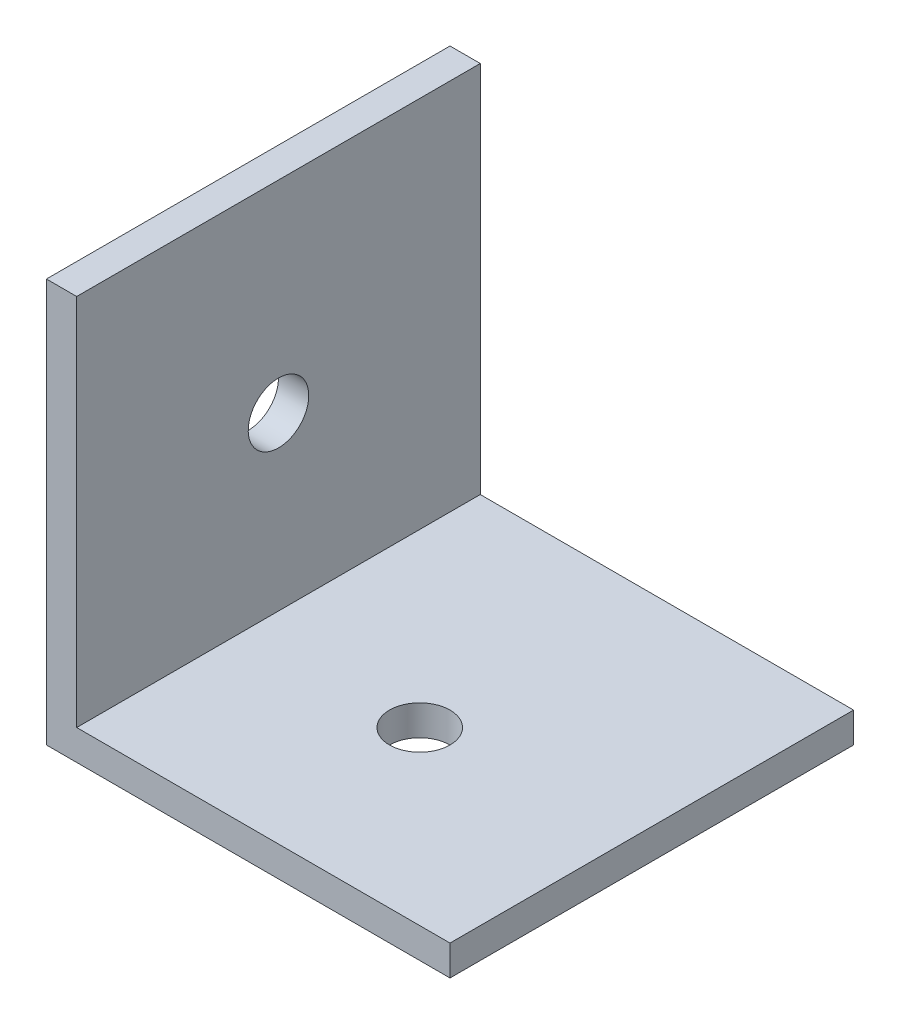
ISO-10303-21;
HEADER;
FILE_DESCRIPTION(('STEP AP214'),'2;1');
FILE_NAME('part.step','',(''),(''),'','','');
FILE_SCHEMA(('AUTOMOTIVE_DESIGN { 1 0 10303 214 1 1 1 1 }'));
ENDSEC;
DATA;
#1=APPLICATION_CONTEXT('core data for automotive mechanical design processes');
#2=APPLICATION_PROTOCOL_DEFINITION('international standard','automotive_design',2000,#1);
#3=PRODUCT_CONTEXT('',#1,'mechanical');
#4=PRODUCT('Part','Part','',(#3));
#5=PRODUCT_RELATED_PRODUCT_CATEGORY('part','',(#4));
#6=PRODUCT_DEFINITION_FORMATION('','',#4);
#7=PRODUCT_DEFINITION_CONTEXT('part definition',#1,'design');
#8=PRODUCT_DEFINITION('design','',#6,#7);
#9=PRODUCT_DEFINITION_SHAPE('','',#8);
#10=(LENGTH_UNIT() NAMED_UNIT(*) SI_UNIT(.MILLI.,.METRE.));
#11=(NAMED_UNIT(*) PLANE_ANGLE_UNIT() SI_UNIT($,.RADIAN.));
#12=(NAMED_UNIT(*) SI_UNIT($,.STERADIAN.) SOLID_ANGLE_UNIT());
#13=UNCERTAINTY_MEASURE_WITH_UNIT(LENGTH_MEASURE(1.E-05),#10,'distance_accuracy_value','');
#14=(GEOMETRIC_REPRESENTATION_CONTEXT(3) GLOBAL_UNCERTAINTY_ASSIGNED_CONTEXT((#13)) GLOBAL_UNIT_ASSIGNED_CONTEXT((#10,
#11,#12)) REPRESENTATION_CONTEXT('',''));
#15=CARTESIAN_POINT('',(0.,0.,0.));
#16=DIRECTION('',(0.,0.,1.));
#17=DIRECTION('',(1.,0.,0.));
#18=AXIS2_PLACEMENT_3D('',#15,#16,#17);
#19=CARTESIAN_POINT('',(0.,20.,20.));
#20=DIRECTION('',(1.,0.,0.));
#21=DIRECTION('',(0.,1.,0.));
#22=AXIS2_PLACEMENT_3D('',#19,#20,#21);
#23=PLANE('',#22);
#24=CARTESIAN_POINT('',(0.,10.,10.));
#25=DIRECTION('',(1.,0.,0.));
#26=DIRECTION('',(0.,1.,0.));
#27=AXIS2_PLACEMENT_3D('',#24,#25,#26);
#28=CIRCLE('',#27,1.5);
#29=CARTESIAN_POINT('',(0.,11.5,10.));
#30=VERTEX_POINT('',#29);
#31=EDGE_CURVE('E159',#30,#30,#28,.T.);
#32=ORIENTED_EDGE('',*,*,#31,.T.);
#33=EDGE_LOOP('',(#32));
#34=FACE_BOUND('',#33,.T.);
#35=DIRECTION('',(0.,-1.,0.));
#36=VECTOR('',#35,1.);
#37=CARTESIAN_POINT('',(0.,20.,0.));
#38=LINE('',#37,#36);
#39=CARTESIAN_POINT('',(0.,20.,0.));
#40=VERTEX_POINT('',#39);
#41=CARTESIAN_POINT('',(0.,0.,0.));
#42=VERTEX_POINT('',#41);
#43=EDGE_CURVE('E115',#40,#42,#38,.T.);
#44=ORIENTED_EDGE('',*,*,#43,.T.);
#45=DIRECTION('',(0.,0.,-1.));
#46=VECTOR('',#45,1.);
#47=CARTESIAN_POINT('',(0.,0.,20.));
#48=LINE('',#47,#46);
#49=CARTESIAN_POINT('',(0.,0.,20.));
#50=VERTEX_POINT('',#49);
#51=EDGE_CURVE('E11',#50,#42,#48,.T.);
#52=ORIENTED_EDGE('',*,*,#51,.F.);
#53=DIRECTION('',(0.,-1.,0.));
#54=VECTOR('',#53,1.);
#55=CARTESIAN_POINT('',(0.,20.,20.));
#56=LINE('',#55,#54);
#57=CARTESIAN_POINT('',(0.,20.,20.));
#58=VERTEX_POINT('',#57);
#59=EDGE_CURVE('E126',#58,#50,#56,.T.);
#60=ORIENTED_EDGE('',*,*,#59,.F.);
#61=DIRECTION('',(0.,0.,-1.));
#62=VECTOR('',#61,1.);
#63=CARTESIAN_POINT('',(0.,20.,20.));
#64=LINE('',#63,#62);
#65=EDGE_CURVE('E111',#58,#40,#64,.T.);
#66=ORIENTED_EDGE('',*,*,#65,.T.);
#67=EDGE_LOOP('',(#44,#52,#60,#66));
#68=FACE_BOUND('',#67,.T.);
#69=ADVANCED_FACE('F31',(#34,#68),#23,.F.);
#70=CARTESIAN_POINT('',(0.,0.,20.));
#71=DIRECTION('',(0.,1.,0.));
#72=DIRECTION('',(0.,0.,1.));
#73=AXIS2_PLACEMENT_3D('',#70,#71,#72);
#74=PLANE('',#73);
#75=CARTESIAN_POINT('',(10.,0.,11.5));
#76=DIRECTION('',(0.,1.,0.));
#77=DIRECTION('',(-1.,0.,0.));
#78=AXIS2_PLACEMENT_3D('',#75,#76,#77);
#79=CIRCLE('',#78,1.5);
#80=CARTESIAN_POINT('',(8.5,0.,11.5));
#81=VERTEX_POINT('',#80);
#82=EDGE_CURVE('E119',#81,#81,#79,.T.);
#83=ORIENTED_EDGE('',*,*,#82,.T.);
#84=EDGE_LOOP('',(#83));
#85=FACE_BOUND('',#84,.T.);
#86=DIRECTION('',(1.,0.,0.));
#87=VECTOR('',#86,1.);
#88=CARTESIAN_POINT('',(0.,0.,0.));
#89=LINE('',#88,#87);
#90=CARTESIAN_POINT('',(20.,0.,0.));
#91=VERTEX_POINT('',#90);
#92=EDGE_CURVE('E118',#42,#91,#89,.T.);
#93=ORIENTED_EDGE('',*,*,#92,.T.);
#94=DIRECTION('',(0.,0.,-1.));
#95=VECTOR('',#94,1.);
#96=CARTESIAN_POINT('',(20.,0.,20.));
#97=LINE('',#96,#95);
#98=CARTESIAN_POINT('',(20.,0.,20.));
#99=VERTEX_POINT('',#98);
#100=EDGE_CURVE('E39',#99,#91,#97,.T.);
#101=ORIENTED_EDGE('',*,*,#100,.F.);
#102=DIRECTION('',(1.,0.,0.));
#103=VECTOR('',#102,1.);
#104=CARTESIAN_POINT('',(0.,0.,20.));
#105=LINE('',#104,#103);
#106=EDGE_CURVE('E84',#50,#99,#105,.T.);
#107=ORIENTED_EDGE('',*,*,#106,.F.);
#108=ORIENTED_EDGE('',*,*,#51,.T.);
#109=EDGE_LOOP('',(#93,#101,#107,#108));
#110=FACE_BOUND('',#109,.T.);
#111=ADVANCED_FACE('F151',(#85,#110),#74,.F.);
#112=CARTESIAN_POINT('',(20.,0.,20.));
#113=DIRECTION('',(-1.,0.,0.));
#114=DIRECTION('',(0.,0.,1.));
#115=AXIS2_PLACEMENT_3D('',#112,#113,#114);
#116=PLANE('',#115);
#117=DIRECTION('',(0.,1.,0.));
#118=VECTOR('',#117,1.);
#119=CARTESIAN_POINT('',(20.,0.,0.));
#120=LINE('',#119,#118);
#121=CARTESIAN_POINT('',(20.,1.5,0.));
#122=VERTEX_POINT('',#121);
#123=EDGE_CURVE('E121',#91,#122,#120,.T.);
#124=ORIENTED_EDGE('',*,*,#123,.T.);
#125=DIRECTION('',(0.,0.,-1.));
#126=VECTOR('',#125,1.);
#127=CARTESIAN_POINT('',(20.,1.5,20.));
#128=LINE('',#127,#126);
#129=CARTESIAN_POINT('',(20.,1.5,20.));
#130=VERTEX_POINT('',#129);
#131=EDGE_CURVE('E106',#130,#122,#128,.T.);
#132=ORIENTED_EDGE('',*,*,#131,.F.);
#133=DIRECTION('',(0.,1.,0.));
#134=VECTOR('',#133,1.);
#135=CARTESIAN_POINT('',(20.,0.,20.));
#136=LINE('',#135,#134);
#137=EDGE_CURVE('E97',#99,#130,#136,.T.);
#138=ORIENTED_EDGE('',*,*,#137,.F.);
#139=ORIENTED_EDGE('',*,*,#100,.T.);
#140=EDGE_LOOP('',(#124,#132,#138,#139));
#141=FACE_BOUND('',#140,.T.);
#142=ADVANCED_FACE('F132',(#141),#116,.F.);
#143=CARTESIAN_POINT('',(20.,1.5,20.));
#144=DIRECTION('',(0.,-1.,0.));
#145=DIRECTION('',(1.,0.,0.));
#146=AXIS2_PLACEMENT_3D('',#143,#144,#145);
#147=PLANE('',#146);
#148=CARTESIAN_POINT('',(10.,1.5,11.5));
#149=DIRECTION('',(0.,1.,0.));
#150=DIRECTION('',(-1.,0.,0.));
#151=AXIS2_PLACEMENT_3D('',#148,#149,#150);
#152=CIRCLE('',#151,1.5);
#153=CARTESIAN_POINT('',(8.5,1.5,11.5));
#154=VERTEX_POINT('',#153);
#155=EDGE_CURVE('E161',#154,#154,#152,.T.);
#156=ORIENTED_EDGE('',*,*,#155,.F.);
#157=EDGE_LOOP('',(#156));
#158=FACE_BOUND('',#157,.T.);
#159=DIRECTION('',(-1.,0.,0.));
#160=VECTOR('',#159,1.);
#161=CARTESIAN_POINT('',(20.,1.5,0.));
#162=LINE('',#161,#160);
#163=CARTESIAN_POINT('',(1.5,1.5,0.));
#164=VERTEX_POINT('',#163);
#165=EDGE_CURVE('E105',#122,#164,#162,.T.);
#166=ORIENTED_EDGE('',*,*,#165,.T.);
#167=DIRECTION('',(0.,0.,-1.));
#168=VECTOR('',#167,1.);
#169=CARTESIAN_POINT('',(1.5,1.5,20.));
#170=LINE('',#169,#168);
#171=CARTESIAN_POINT('',(1.5,1.5,20.));
#172=VERTEX_POINT('',#171);
#173=EDGE_CURVE('E102',#172,#164,#170,.T.);
#174=ORIENTED_EDGE('',*,*,#173,.F.);
#175=DIRECTION('',(-1.,0.,0.));
#176=VECTOR('',#175,1.);
#177=CARTESIAN_POINT('',(20.,1.5,20.));
#178=LINE('',#177,#176);
#179=EDGE_CURVE('E91',#130,#172,#178,.T.);
#180=ORIENTED_EDGE('',*,*,#179,.F.);
#181=ORIENTED_EDGE('',*,*,#131,.T.);
#182=EDGE_LOOP('',(#166,#174,#180,#181));
#183=FACE_BOUND('',#182,.T.);
#184=ADVANCED_FACE('F103',(#158,#183),#147,.F.);
#185=CARTESIAN_POINT('',(1.5,1.5,20.));
#186=DIRECTION('',(-1.,0.,0.));
#187=DIRECTION('',(0.,-1.,0.));
#188=AXIS2_PLACEMENT_3D('',#185,#186,#187);
#189=PLANE('',#188);
#190=CARTESIAN_POINT('',(1.5,10.,10.));
#191=DIRECTION('',(1.,0.,0.));
#192=DIRECTION('',(0.,1.,0.));
#193=AXIS2_PLACEMENT_3D('',#190,#191,#192);
#194=CIRCLE('',#193,1.5);
#195=CARTESIAN_POINT('',(1.5,11.5,10.));
#196=VERTEX_POINT('',#195);
#197=EDGE_CURVE('E162',#196,#196,#194,.T.);
#198=ORIENTED_EDGE('',*,*,#197,.F.);
#199=EDGE_LOOP('',(#198));
#200=FACE_BOUND('',#199,.T.);
#201=DIRECTION('',(0.,1.,0.));
#202=VECTOR('',#201,1.);
#203=CARTESIAN_POINT('',(1.5,1.5,0.));
#204=LINE('',#203,#202);
#205=CARTESIAN_POINT('',(1.5,20.,0.));
#206=VERTEX_POINT('',#205);
#207=EDGE_CURVE('E70',#164,#206,#204,.T.);
#208=ORIENTED_EDGE('',*,*,#207,.T.);
#209=DIRECTION('',(0.,0.,-1.));
#210=VECTOR('',#209,1.);
#211=CARTESIAN_POINT('',(1.5,20.,20.));
#212=LINE('',#211,#210);
#213=CARTESIAN_POINT('',(1.5,20.,20.));
#214=VERTEX_POINT('',#213);
#215=EDGE_CURVE('E107',#214,#206,#212,.T.);
#216=ORIENTED_EDGE('',*,*,#215,.F.);
#217=DIRECTION('',(0.,1.,0.));
#218=VECTOR('',#217,1.);
#219=CARTESIAN_POINT('',(1.5,1.5,20.));
#220=LINE('',#219,#218);
#221=EDGE_CURVE('E95',#172,#214,#220,.T.);
#222=ORIENTED_EDGE('',*,*,#221,.F.);
#223=ORIENTED_EDGE('',*,*,#173,.T.);
#224=EDGE_LOOP('',(#208,#216,#222,#223));
#225=FACE_BOUND('',#224,.T.);
#226=ADVANCED_FACE('F109',(#200,#225),#189,.F.);
#227=CARTESIAN_POINT('',(1.5,20.,20.));
#228=DIRECTION('',(0.,-1.,0.));
#229=DIRECTION('',(0.,0.,-1.));
#230=AXIS2_PLACEMENT_3D('',#227,#228,#229);
#231=PLANE('',#230);
#232=DIRECTION('',(-1.,0.,0.));
#233=VECTOR('',#232,1.);
#234=CARTESIAN_POINT('',(1.5,20.,0.));
#235=LINE('',#234,#233);
#236=EDGE_CURVE('E76',#206,#40,#235,.T.);
#237=ORIENTED_EDGE('',*,*,#236,.T.);
#238=ORIENTED_EDGE('',*,*,#65,.F.);
#239=DIRECTION('',(-1.,0.,0.));
#240=VECTOR('',#239,1.);
#241=CARTESIAN_POINT('',(1.5,20.,20.));
#242=LINE('',#241,#240);
#243=EDGE_CURVE('E47',#214,#58,#242,.T.);
#244=ORIENTED_EDGE('',*,*,#243,.F.);
#245=ORIENTED_EDGE('',*,*,#215,.T.);
#246=EDGE_LOOP('',(#237,#238,#244,#245));
#247=FACE_BOUND('',#246,.T.);
#248=ADVANCED_FACE('F139',(#247),#231,.F.);
#249=CARTESIAN_POINT('',(0.,0.,20.));
#250=DIRECTION('',(0.,0.,1.));
#251=DIRECTION('',(1.,0.,0.));
#252=AXIS2_PLACEMENT_3D('',#249,#250,#251);
#253=PLANE('',#252);
#254=ORIENTED_EDGE('',*,*,#59,.T.);
#255=ORIENTED_EDGE('',*,*,#106,.T.);
#256=ORIENTED_EDGE('',*,*,#137,.T.);
#257=ORIENTED_EDGE('',*,*,#179,.T.);
#258=ORIENTED_EDGE('',*,*,#221,.T.);
#259=ORIENTED_EDGE('',*,*,#243,.T.);
#260=EDGE_LOOP('',(#254,#255,#256,#257,#258,#259));
#261=FACE_BOUND('',#260,.T.);
#262=ADVANCED_FACE('F93',(#261),#253,.T.);
#263=CARTESIAN_POINT('',(0.,0.,0.));
#264=DIRECTION('',(0.,0.,1.));
#265=DIRECTION('',(1.,0.,0.));
#266=AXIS2_PLACEMENT_3D('',#263,#264,#265);
#267=PLANE('',#266);
#268=ORIENTED_EDGE('',*,*,#43,.F.);
#269=ORIENTED_EDGE('',*,*,#236,.F.);
#270=ORIENTED_EDGE('',*,*,#207,.F.);
#271=ORIENTED_EDGE('',*,*,#165,.F.);
#272=ORIENTED_EDGE('',*,*,#123,.F.);
#273=ORIENTED_EDGE('',*,*,#92,.F.);
#274=EDGE_LOOP('',(#268,#269,#270,#271,#272,#273));
#275=FACE_BOUND('',#274,.T.);
#276=ADVANCED_FACE('F135',(#275),#267,.F.);
#277=CARTESIAN_POINT('',(10.,0.,11.5));
#278=DIRECTION('',(0.,1.,0.));
#279=DIRECTION('',(-1.,0.,0.));
#280=AXIS2_PLACEMENT_3D('',#277,#278,#279);
#281=CYLINDRICAL_SURFACE('',#280,1.5);
#282=ORIENTED_EDGE('',*,*,#82,.F.);
#283=EDGE_LOOP('',(#282));
#284=FACE_BOUND('',#283,.T.);
#285=ORIENTED_EDGE('',*,*,#155,.T.);
#286=EDGE_LOOP('',(#285));
#287=FACE_BOUND('',#286,.T.);
#288=ADVANCED_FACE('F174',(#284,#287),#281,.F.);
#289=CARTESIAN_POINT('',(0.,10.,10.));
#290=DIRECTION('',(1.,0.,0.));
#291=DIRECTION('',(0.,1.,0.));
#292=AXIS2_PLACEMENT_3D('',#289,#290,#291);
#293=CYLINDRICAL_SURFACE('',#292,1.5);
#294=ORIENTED_EDGE('',*,*,#31,.F.);
#295=EDGE_LOOP('',(#294));
#296=FACE_BOUND('',#295,.T.);
#297=ORIENTED_EDGE('',*,*,#197,.T.);
#298=EDGE_LOOP('',(#297));
#299=FACE_BOUND('',#298,.T.);
#300=ADVANCED_FACE('F177',(#296,#299),#293,.F.);
#301=CLOSED_SHELL('',(#69,#111,#142,#184,#226,#248,#262,#276,#288,#300));
#302=MANIFOLD_SOLID_BREP('B2',#301);
#303=ADVANCED_BREP_SHAPE_REPRESENTATION('',(#18,#302),#14);
#304=SHAPE_DEFINITION_REPRESENTATION(#9,#303);
ENDSEC;
END-ISO-10303-21;
